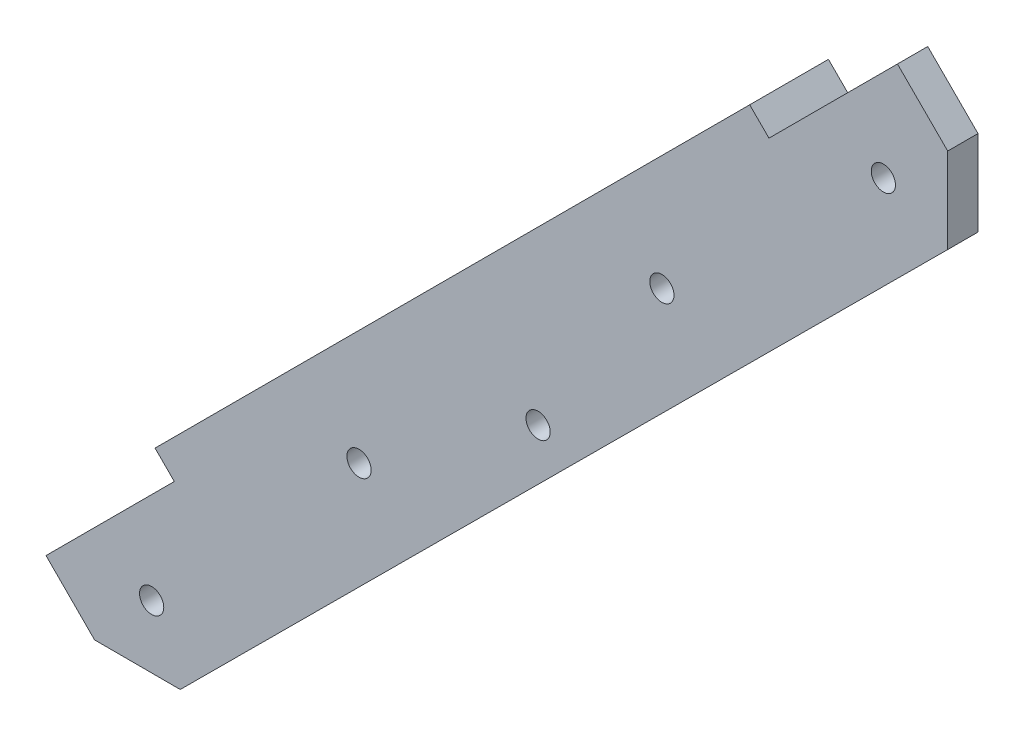
ISO-10303-21;
HEADER;
FILE_DESCRIPTION(('STEP AP214'),'2;1');
FILE_NAME('part.step','',(''),(''),'','','');
FILE_SCHEMA(('AUTOMOTIVE_DESIGN { 1 0 10303 214 1 1 1 1 }'));
ENDSEC;
DATA;
#1=APPLICATION_CONTEXT('core data for automotive mechanical design processes');
#2=APPLICATION_PROTOCOL_DEFINITION('international standard','automotive_design',2000,#1);
#3=PRODUCT_CONTEXT('',#1,'mechanical');
#4=PRODUCT('Part','Part','',(#3));
#5=PRODUCT_RELATED_PRODUCT_CATEGORY('part','',(#4));
#6=PRODUCT_DEFINITION_FORMATION('','',#4);
#7=PRODUCT_DEFINITION_CONTEXT('part definition',#1,'design');
#8=PRODUCT_DEFINITION('design','',#6,#7);
#9=PRODUCT_DEFINITION_SHAPE('','',#8);
#10=(LENGTH_UNIT() NAMED_UNIT(*) SI_UNIT(.MILLI.,.METRE.));
#11=(NAMED_UNIT(*) PLANE_ANGLE_UNIT() SI_UNIT($,.RADIAN.));
#12=(NAMED_UNIT(*) SI_UNIT($,.STERADIAN.) SOLID_ANGLE_UNIT());
#13=UNCERTAINTY_MEASURE_WITH_UNIT(LENGTH_MEASURE(1.E-05),#10,'distance_accuracy_value','');
#14=(GEOMETRIC_REPRESENTATION_CONTEXT(3) GLOBAL_UNCERTAINTY_ASSIGNED_CONTEXT((#13)) GLOBAL_UNIT_ASSIGNED_CONTEXT((#10,
#11,#12)) REPRESENTATION_CONTEXT('',''));
#15=CARTESIAN_POINT('',(0.,0.,0.));
#16=DIRECTION('',(0.,0.,1.));
#17=DIRECTION('',(1.,0.,0.));
#18=AXIS2_PLACEMENT_3D('',#15,#16,#17);
#19=CARTESIAN_POINT('',(111.999999999999,110.,-8.00100000000389));
#20=DIRECTION('',(0.,0.,1.));
#21=DIRECTION('',(1.,0.,0.));
#22=AXIS2_PLACEMENT_3D('',#19,#20,#21);
#23=CYLINDRICAL_SURFACE('',#22,1.99999999999992);
#24=CARTESIAN_POINT('',(111.999999999999,110.,5.));
#25=DIRECTION('',(0.,0.,1.));
#26=DIRECTION('',(1.,0.,0.));
#27=AXIS2_PLACEMENT_3D('',#24,#25,#26);
#28=CIRCLE('',#27,1.99999999999992);
#29=CARTESIAN_POINT('',(113.999999999999,110.,5.));
#30=VERTEX_POINT('',#29);
#31=EDGE_CURVE('E224',#30,#30,#28,.T.);
#32=ORIENTED_EDGE('',*,*,#31,.T.);
#33=EDGE_LOOP('',(#32));
#34=FACE_BOUND('',#33,.T.);
#35=CARTESIAN_POINT('',(111.999999999999,110.,-5.00000000000385));
#36=DIRECTION('',(0.,0.,-1.));
#37=DIRECTION('',(0.,1.,0.));
#38=AXIS2_PLACEMENT_3D('',#35,#36,#37);
#39=CIRCLE('',#38,1.99999999999992);
#40=CARTESIAN_POINT('',(111.999999999999,112.,-5.00000000000385));
#41=VERTEX_POINT('',#40);
#42=EDGE_CURVE('E227',#41,#41,#39,.F.);
#43=ORIENTED_EDGE('',*,*,#42,.F.);
#44=EDGE_LOOP('',(#43));
#45=FACE_BOUND('',#44,.T.);
#46=ADVANCED_FACE('F39',(#34,#45),#23,.F.);
#47=CARTESIAN_POINT('',(61.9999999999991,60.0000000000004,-8.00100000000389));
#48=DIRECTION('',(0.,0.,1.));
#49=DIRECTION('',(1.,0.,0.));
#50=AXIS2_PLACEMENT_3D('',#47,#48,#49);
#51=CYLINDRICAL_SURFACE('',#50,1.99999999999989);
#52=CARTESIAN_POINT('',(61.9999999999991,60.0000000000004,5.));
#53=DIRECTION('',(0.,0.,1.));
#54=DIRECTION('',(1.,0.,0.));
#55=AXIS2_PLACEMENT_3D('',#52,#53,#54);
#56=CIRCLE('',#55,1.99999999999989);
#57=CARTESIAN_POINT('',(63.999999999999,60.0000000000004,5.));
#58=VERTEX_POINT('',#57);
#59=EDGE_CURVE('E220',#58,#58,#56,.T.);
#60=ORIENTED_EDGE('',*,*,#59,.T.);
#61=EDGE_LOOP('',(#60));
#62=FACE_BOUND('',#61,.T.);
#63=CARTESIAN_POINT('',(61.9999999999991,60.0000000000004,-5.00000000000388));
#64=DIRECTION('',(0.,0.,-1.));
#65=DIRECTION('',(0.,1.,0.));
#66=AXIS2_PLACEMENT_3D('',#63,#64,#65);
#67=CIRCLE('',#66,1.99999999999989);
#68=CARTESIAN_POINT('',(61.9999999999991,62.0000000000003,-5.00000000000388));
#69=VERTEX_POINT('',#68);
#70=EDGE_CURVE('E211',#69,#69,#67,.F.);
#71=ORIENTED_EDGE('',*,*,#70,.F.);
#72=EDGE_LOOP('',(#71));
#73=FACE_BOUND('',#72,.T.);
#74=ADVANCED_FACE('F380',(#62,#73),#51,.F.);
#75=CARTESIAN_POINT('',(0.,0.,0.));
#76=DIRECTION('',(0.,0.,-1.));
#77=DIRECTION('',(-1.,0.,0.));
#78=AXIS2_PLACEMENT_3D('',#75,#76,#77);
#79=PLANE('',#78);
#80=DIRECTION('',(0.708378811392067,0.705832458569852,0.));
#81=VECTOR('',#80,1.);
#82=CARTESIAN_POINT('',(144.999999999996,125.000009715621,0.));
#83=LINE('',#82,#81);
#84=CARTESIAN_POINT('',(32.4788703815637,12.8833508286033,0.));
#85=VERTEX_POINT('',#84);
#86=CARTESIAN_POINT('',(46.6133955019609,26.9670676987364,0.));
#87=VERTEX_POINT('',#86);
#88=EDGE_CURVE('E285',#85,#87,#83,.T.);
#89=ORIENTED_EDGE('',*,*,#88,.F.);
#90=DIRECTION('',(0.999998379020512,-0.0018005433478821,0.));
#91=VECTOR('',#90,1.);
#92=CARTESIAN_POINT('',(0.023302289110957,12.9417885805603,0.));
#93=LINE('',#92,#91);
#94=CARTESIAN_POINT('',(18.3367576819445,12.9088143568254,0.));
#95=VERTEX_POINT('',#94);
#96=EDGE_CURVE('E63',#85,#95,#93,.F.);
#97=ORIENTED_EDGE('',*,*,#96,.T.);
#98=DIRECTION('',(0.705832458569853,-0.708378811392066,0.));
#99=VECTOR('',#98,1.);
#100=CARTESIAN_POINT('',(25.3950822676431,5.82502624290472,0.));
#101=LINE('',#100,#99);
#102=CARTESIAN_POINT('',(10.3192285063964,20.9552674757194,0.));
#103=VERTEX_POINT('',#102);
#104=EDGE_CURVE('E269',#103,#95,#101,.T.);
#105=ORIENTED_EDGE('',*,*,#104,.F.);
#106=DIRECTION('',(-0.707106781186551,-0.707106781186544,0.));
#107=VECTOR('',#106,1.);
#108=CARTESIAN_POINT('',(31.5052038200413,42.1412427893641,0.));
#109=LINE('',#108,#107);
#110=CARTESIAN_POINT('',(31.4994745169042,42.1355134862271,0.));
#111=VERTEX_POINT('',#110);
#112=EDGE_CURVE('E295',#111,#103,#109,.T.);
#113=ORIENTED_EDGE('',*,*,#112,.F.);
#114=DIRECTION('',(-0.705832458569853,0.708378811392066,0.));
#115=VECTOR('',#114,1.);
#116=CARTESIAN_POINT('',(28.3232233047018,45.3232233047036,0.));
#117=LINE('',#116,#115);
#118=EDGE_CURVE('E244',#87,#111,#117,.T.);
#119=ORIENTED_EDGE('',*,*,#118,.F.);
#120=EDGE_LOOP('',(#89,#97,#105,#113,#119));
#121=FACE_BOUND('',#120,.T.);
#122=CARTESIAN_POINT('',(27.7621167157391,23.2569128956978,0.));
#123=DIRECTION('',(0.,0.,-1.));
#124=DIRECTION('',(-1.,0.,0.));
#125=AXIS2_PLACEMENT_3D('',#122,#123,#124);
#126=CIRCLE('',#125,2.);
#127=CARTESIAN_POINT('',(25.7621167157391,23.2569128956978,0.));
#128=VERTEX_POINT('',#127);
#129=EDGE_CURVE('E316',#128,#128,#126,.T.);
#130=ORIENTED_EDGE('',*,*,#129,.F.);
#131=EDGE_LOOP('',(#130));
#132=FACE_BOUND('',#131,.T.);
#133=ADVANCED_FACE('F387',(#121,#132),#79,.T.);
#134=CARTESIAN_POINT('',(144.999999999996,125.000009715621,5.));
#135=DIRECTION('',(-0.705832458569852,0.708378811392067,0.));
#136=DIRECTION('',(-0.708378811392067,-0.705832458569852,0.));
#137=AXIS2_PLACEMENT_3D('',#134,#135,#136);
#138=PLANE('',#137);
#139=DIRECTION('',(0.708378811392067,0.705832458569853,0.));
#140=VECTOR('',#139,1.);
#141=CARTESIAN_POINT('',(46.6133955019609,26.9670676987363,-8.00000000000389));
#142=LINE('',#141,#140);
#143=CARTESIAN_POINT('',(46.6133955019609,26.9670676987363,-8.00000000000389));
#144=VERTEX_POINT('',#143);
#145=CARTESIAN_POINT('',(86.0012902722658,66.2133779447775,-8.00000000000387));
#146=VERTEX_POINT('',#145);
#147=EDGE_CURVE('E228',#144,#146,#142,.T.);
#148=ORIENTED_EDGE('',*,*,#147,.T.);
#149=DIRECTION('',(0.,0.,1.));
#150=VECTOR('',#149,1.);
#151=CARTESIAN_POINT('',(86.0012902722658,66.2133779447776,4.99999999999997));
#152=LINE('',#151,#150);
#153=CARTESIAN_POINT('',(86.0012902722658,66.2133779447775,-1.00000000000387));
#154=VERTEX_POINT('',#153);
#155=EDGE_CURVE('E204',#146,#154,#152,.T.);
#156=ORIENTED_EDGE('',*,*,#155,.T.);
#157=DIRECTION('',(-0.708378811392067,-0.705832458569852,0.));
#158=VECTOR('',#157,1.);
#159=CARTESIAN_POINT('',(144.999999999996,125.000009715621,-1.00000000000384));
#160=LINE('',#159,#158);
#161=CARTESIAN_POINT('',(105.612105229692,85.7536994695806,-1.00000000000386));
#162=VERTEX_POINT('',#161);
#163=EDGE_CURVE('E11',#162,#154,#160,.T.);
#164=ORIENTED_EDGE('',*,*,#163,.F.);
#165=DIRECTION('',(0.,0.,-1.));
#166=VECTOR('',#165,1.);
#167=CARTESIAN_POINT('',(105.612105229692,85.7536994695806,4.99999999999998));
#168=LINE('',#167,#166);
#169=CARTESIAN_POINT('',(105.612105229692,85.7536994695806,-8.00000000000386));
#170=VERTEX_POINT('',#169);
#171=EDGE_CURVE('E200',#162,#170,#168,.T.);
#172=ORIENTED_EDGE('',*,*,#171,.T.);
#173=CARTESIAN_POINT('',(144.999999999997,125.000009715622,-8.00000000000384));
#174=VERTEX_POINT('',#173);
#175=EDGE_CURVE('E232',#170,#174,#142,.T.);
#176=ORIENTED_EDGE('',*,*,#175,.T.);
#177=DIRECTION('',(0.,0.,1.));
#178=VECTOR('',#177,1.);
#179=CARTESIAN_POINT('',(144.999999999997,125.000009715622,-172.904201471418));
#180=LINE('',#179,#178);
#181=CARTESIAN_POINT('',(144.999999999997,125.000009715622,0.));
#182=VERTEX_POINT('',#181);
#183=EDGE_CURVE('E253',#174,#182,#180,.T.);
#184=ORIENTED_EDGE('',*,*,#183,.T.);
#185=CARTESIAN_POINT('',(159.167576227838,139.116658887018,0.));
#186=VERTEX_POINT('',#185);
#187=EDGE_CURVE('E288',#182,#186,#83,.T.);
#188=ORIENTED_EDGE('',*,*,#187,.T.);
#189=DIRECTION('',(0.,0.,1.));
#190=VECTOR('',#189,1.);
#191=CARTESIAN_POINT('',(159.167576227838,139.116658887018,5.));
#192=LINE('',#191,#190);
#193=CARTESIAN_POINT('',(159.167576227837,139.116658887018,5.));
#194=VERTEX_POINT('',#193);
#195=EDGE_CURVE('E326',#186,#194,#192,.T.);
#196=ORIENTED_EDGE('',*,*,#195,.T.);
#197=DIRECTION('',(0.708378811392066,0.705832458569853,0.));
#198=VECTOR('',#197,1.);
#199=CARTESIAN_POINT('',(46.6464466094051,27.0000000000003,5.));
#200=LINE('',#199,#198);
#201=CARTESIAN_POINT('',(32.4788703815637,12.8833508286032,5.));
#202=VERTEX_POINT('',#201);
#203=EDGE_CURVE('E265',#202,#194,#200,.T.);
#204=ORIENTED_EDGE('',*,*,#203,.F.);
#205=DIRECTION('',(0.,0.,-1.));
#206=VECTOR('',#205,1.);
#207=CARTESIAN_POINT('',(32.4788703815637,12.8833508286033,5.));
#208=LINE('',#207,#206);
#209=EDGE_CURVE('E323',#202,#85,#208,.T.);
#210=ORIENTED_EDGE('',*,*,#209,.T.);
#211=ORIENTED_EDGE('',*,*,#88,.T.);
#212=DIRECTION('',(0.,0.,1.));
#213=VECTOR('',#212,1.);
#214=CARTESIAN_POINT('',(46.6133955019609,26.9670676987363,-172.904201471418));
#215=LINE('',#214,#213);
#216=EDGE_CURVE('E250',#144,#87,#215,.T.);
#217=ORIENTED_EDGE('',*,*,#216,.F.);
#218=EDGE_LOOP('',(#148,#156,#164,#172,#176,#184,#188,#196,#204,#210,#211,#217));
#219=FACE_BOUND('',#218,.T.);
#220=ADVANCED_FACE('F344',(#219),#138,.F.);
#221=CARTESIAN_POINT('',(166.251364341758,146.174983472716,5.));
#222=DIRECTION('',(-0.707106781186548,-0.707106781186547,0.));
#223=DIRECTION('',(0.707106781186547,-0.707106781186548,0.));
#224=AXIS2_PLACEMENT_3D('',#221,#222,#223);
#225=PLANE('',#224);
#226=DIRECTION('',(-0.707106781186547,0.707106781186548,0.));
#227=VECTOR('',#226,1.);
#228=CARTESIAN_POINT('',(166.251364341758,146.174983472716,5.));
#229=LINE('',#228,#227);
#230=CARTESIAN_POINT('',(159.192993990203,153.233353824272,5.));
#231=VERTEX_POINT('',#230);
#232=CARTESIAN_POINT('',(150.895154422576,161.531193391899,5.));
#233=VERTEX_POINT('',#232);
#234=EDGE_CURVE('E268',#231,#233,#229,.T.);
#235=ORIENTED_EDGE('',*,*,#234,.F.);
#236=DIRECTION('',(0.,0.,-1.));
#237=VECTOR('',#236,1.);
#238=CARTESIAN_POINT('',(159.192993990203,153.233353824272,5.));
#239=LINE('',#238,#237);
#240=CARTESIAN_POINT('',(159.192993990203,153.233353824272,0.));
#241=VERTEX_POINT('',#240);
#242=EDGE_CURVE('E242',#231,#241,#239,.T.);
#243=ORIENTED_EDGE('',*,*,#242,.T.);
#244=DIRECTION('',(-0.707106781186547,0.707106781186548,0.));
#245=VECTOR('',#244,1.);
#246=CARTESIAN_POINT('',(166.251364341758,146.174983472716,0.));
#247=LINE('',#246,#245);
#248=CARTESIAN_POINT('',(150.895154422576,161.531193391899,0.));
#249=VERTEX_POINT('',#248);
#250=EDGE_CURVE('E287',#241,#249,#247,.T.);
#251=ORIENTED_EDGE('',*,*,#250,.T.);
#252=DIRECTION('',(0.,0.,-1.));
#253=VECTOR('',#252,1.);
#254=CARTESIAN_POINT('',(150.895154422576,161.531193391899,5.));
#255=LINE('',#254,#253);
#256=EDGE_CURVE('E243',#233,#249,#255,.T.);
#257=ORIENTED_EDGE('',*,*,#256,.F.);
#258=EDGE_LOOP('',(#235,#243,#251,#257));
#259=FACE_BOUND('',#258,.T.);
#260=ADVANCED_FACE('F437',(#259),#225,.F.);
#261=CARTESIAN_POINT('',(150.895154422576,161.531193391899,5.));
#262=DIRECTION('',(0.7071067811865,-0.707106781186595,0.));
#263=DIRECTION('',(0.707106781186595,0.7071067811865,0.));
#264=AXIS2_PLACEMENT_3D('',#261,#262,#263);
#265=PLANE('',#264);
#266=DIRECTION('',(-0.707106781186595,-0.7071067811865,0.));
#267=VECTOR('',#266,1.);
#268=CARTESIAN_POINT('',(150.895154422576,161.531193391899,0.));
#269=LINE('',#268,#267);
#270=CARTESIAN_POINT('',(129.681985373146,140.318024342472,0.));
#271=VERTEX_POINT('',#270);
#272=EDGE_CURVE('E290',#249,#271,#269,.T.);
#273=ORIENTED_EDGE('',*,*,#272,.T.);
#274=DIRECTION('',(0.,0.,-1.));
#275=VECTOR('',#274,1.);
#276=CARTESIAN_POINT('',(129.681985373146,140.318024342472,5.));
#277=LINE('',#276,#275);
#278=CARTESIAN_POINT('',(129.681985373146,140.318024342472,5.));
#279=VERTEX_POINT('',#278);
#280=EDGE_CURVE('E309',#279,#271,#277,.T.);
#281=ORIENTED_EDGE('',*,*,#280,.F.);
#282=DIRECTION('',(-0.707106781186595,-0.7071067811865,0.));
#283=VECTOR('',#282,1.);
#284=CARTESIAN_POINT('',(150.895154422576,161.531193391899,5.));
#285=LINE('',#284,#283);
#286=EDGE_CURVE('E271',#233,#279,#285,.T.);
#287=ORIENTED_EDGE('',*,*,#286,.F.);
#288=ORIENTED_EDGE('',*,*,#256,.T.);
#289=EDGE_LOOP('',(#273,#281,#287,#288));
#290=FACE_BOUND('',#289,.T.);
#291=ADVANCED_FACE('F434',(#290),#265,.F.);
#292=CARTESIAN_POINT('',(129.681985373146,140.318024342472,5.));
#293=DIRECTION('',(-0.707106781186588,-0.707106781186507,0.));
#294=DIRECTION('',(0.707106781186507,-0.707106781186588,0.));
#295=AXIS2_PLACEMENT_3D('',#292,#293,#294);
#296=PLANE('',#295);
#297=ORIENTED_EDGE('',*,*,#280,.T.);
#298=DIRECTION('',(0.707106781186548,-0.707106781186547,0.));
#299=VECTOR('',#298,1.);
#300=CARTESIAN_POINT('',(144.999999999997,125.000009715622,0.));
#301=LINE('',#300,#299);
#302=EDGE_CURVE('E239',#271,#182,#301,.T.);
#303=ORIENTED_EDGE('',*,*,#302,.T.);
#304=ORIENTED_EDGE('',*,*,#183,.F.);
#305=DIRECTION('',(-0.707106781186548,0.707106781186547,0.));
#306=VECTOR('',#305,1.);
#307=CARTESIAN_POINT('',(144.999999999997,125.000009715622,-8.00000000000384));
#308=LINE('',#307,#306);
#309=CARTESIAN_POINT('',(126.500004857807,143.500004857812,-8.00000000000384));
#310=VERTEX_POINT('',#309);
#311=EDGE_CURVE('E231',#174,#310,#308,.T.);
#312=ORIENTED_EDGE('',*,*,#311,.T.);
#313=DIRECTION('',(0.,0.,-1.));
#314=VECTOR('',#313,1.);
#315=CARTESIAN_POINT('',(126.500004857807,143.500004857812,5.));
#316=LINE('',#315,#314);
#317=CARTESIAN_POINT('',(126.500004857807,143.500004857812,5.));
#318=VERTEX_POINT('',#317);
#319=EDGE_CURVE('E307',#318,#310,#316,.T.);
#320=ORIENTED_EDGE('',*,*,#319,.F.);
#321=DIRECTION('',(-0.707106781186507,0.707106781186588,0.));
#322=VECTOR('',#321,1.);
#323=CARTESIAN_POINT('',(129.681985373146,140.318024342472,5.));
#324=LINE('',#323,#322);
#325=EDGE_CURVE('E273',#279,#318,#324,.T.);
#326=ORIENTED_EDGE('',*,*,#325,.F.);
#327=EDGE_LOOP('',(#297,#303,#304,#312,#320,#326));
#328=FACE_BOUND('',#327,.T.);
#329=ADVANCED_FACE('F360',(#328),#296,.F.);
#330=CARTESIAN_POINT('',(126.500004857807,143.500004857812,5.));
#331=DIRECTION('',(0.707106781186559,-0.707106781186536,0.));
#332=DIRECTION('',(0.707106781186536,0.707106781186559,0.));
#333=AXIS2_PLACEMENT_3D('',#330,#331,#332);
#334=PLANE('',#333);
#335=ORIENTED_EDGE('',*,*,#319,.T.);
#336=DIRECTION('',(-0.707106781186536,-0.707106781186559,0.));
#337=VECTOR('',#336,1.);
#338=CARTESIAN_POINT('',(126.500004857807,143.500004857812,-8.00000000000384));
#339=LINE('',#338,#337);
#340=CARTESIAN_POINT('',(28.3232233047018,45.3232233047036,-8.00000000000389));
#341=VERTEX_POINT('',#340);
#342=EDGE_CURVE('E235',#310,#341,#339,.T.);
#343=ORIENTED_EDGE('',*,*,#342,.T.);
#344=DIRECTION('',(0.,0.,1.));
#345=VECTOR('',#344,1.);
#346=CARTESIAN_POINT('',(28.3232233047018,45.3232233047036,-172.904201471418));
#347=LINE('',#346,#345);
#348=CARTESIAN_POINT('',(28.3232233047018,45.3232233047036,0.));
#349=VERTEX_POINT('',#348);
#350=EDGE_CURVE('E247',#341,#349,#347,.T.);
#351=ORIENTED_EDGE('',*,*,#350,.T.);
#352=DIRECTION('',(0.,0.,-1.));
#353=VECTOR('',#352,1.);
#354=CARTESIAN_POINT('',(28.3232233047018,45.3232233047036,5.));
#355=LINE('',#354,#353);
#356=CARTESIAN_POINT('',(28.3232233047018,45.3232233047036,5.));
#357=VERTEX_POINT('',#356);
#358=EDGE_CURVE('E305',#357,#349,#355,.T.);
#359=ORIENTED_EDGE('',*,*,#358,.F.);
#360=DIRECTION('',(-0.707106781186536,-0.707106781186559,0.));
#361=VECTOR('',#360,1.);
#362=CARTESIAN_POINT('',(126.500004857807,143.500004857812,5.));
#363=LINE('',#362,#361);
#364=EDGE_CURVE('E275',#318,#357,#363,.T.);
#365=ORIENTED_EDGE('',*,*,#364,.F.);
#366=EDGE_LOOP('',(#335,#343,#351,#359,#365));
#367=FACE_BOUND('',#366,.T.);
#368=ADVANCED_FACE('F354',(#367),#334,.F.);
#369=CARTESIAN_POINT('',(28.3232233047018,45.3232233047036,5.));
#370=DIRECTION('',(0.707106781186548,0.707106781186547,0.));
#371=DIRECTION('',(-0.707106781186547,0.707106781186548,0.));
#372=AXIS2_PLACEMENT_3D('',#369,#370,#371);
#373=PLANE('',#372);
#374=DIRECTION('',(0.707106781186547,-0.707106781186548,0.));
#375=VECTOR('',#374,1.);
#376=CARTESIAN_POINT('',(28.3232233047018,45.3232233047036,0.));
#377=LINE('',#376,#375);
#378=CARTESIAN_POINT('',(31.5052038200413,42.1412427893641,0.));
#379=VERTEX_POINT('',#378);
#380=EDGE_CURVE('E293',#349,#379,#377,.T.);
#381=ORIENTED_EDGE('',*,*,#380,.T.);
#382=DIRECTION('',(0.,0.,-1.));
#383=VECTOR('',#382,1.);
#384=CARTESIAN_POINT('',(31.5052038200413,42.1412427893641,5.));
#385=LINE('',#384,#383);
#386=CARTESIAN_POINT('',(31.5052038200413,42.1412427893641,5.));
#387=VERTEX_POINT('',#386);
#388=EDGE_CURVE('E302',#387,#379,#385,.T.);
#389=ORIENTED_EDGE('',*,*,#388,.F.);
#390=DIRECTION('',(0.707106781186547,-0.707106781186548,0.));
#391=VECTOR('',#390,1.);
#392=CARTESIAN_POINT('',(28.3232233047018,45.3232233047036,5.));
#393=LINE('',#392,#391);
#394=EDGE_CURVE('E277',#357,#387,#393,.T.);
#395=ORIENTED_EDGE('',*,*,#394,.F.);
#396=ORIENTED_EDGE('',*,*,#358,.T.);
#397=EDGE_LOOP('',(#381,#389,#395,#396));
#398=FACE_BOUND('',#397,.T.);
#399=ADVANCED_FACE('F425',(#398),#373,.F.);
#400=CARTESIAN_POINT('',(31.5052038200413,42.1412427893641,5.));
#401=DIRECTION('',(0.707106781186544,-0.707106781186551,0.));
#402=DIRECTION('',(0.707106781186551,0.707106781186544,0.));
#403=AXIS2_PLACEMENT_3D('',#400,#401,#402);
#404=PLANE('',#403);
#405=EDGE_CURVE('E296',#379,#111,#109,.T.);
#406=ORIENTED_EDGE('',*,*,#405,.T.);
#407=ORIENTED_EDGE('',*,*,#112,.T.);
#408=DIRECTION('',(0.,0.,-1.));
#409=VECTOR('',#408,1.);
#410=CARTESIAN_POINT('',(10.3192285063964,20.9552674757194,5.));
#411=LINE('',#410,#409);
#412=CARTESIAN_POINT('',(10.3192285063964,20.9552674757194,5.));
#413=VERTEX_POINT('',#412);
#414=EDGE_CURVE('E284',#413,#103,#411,.T.);
#415=ORIENTED_EDGE('',*,*,#414,.F.);
#416=DIRECTION('',(-0.707106781186551,-0.707106781186544,0.));
#417=VECTOR('',#416,1.);
#418=CARTESIAN_POINT('',(31.5052038200413,42.1412427893641,5.));
#419=LINE('',#418,#417);
#420=EDGE_CURVE('E279',#387,#413,#419,.T.);
#421=ORIENTED_EDGE('',*,*,#420,.F.);
#422=ORIENTED_EDGE('',*,*,#388,.T.);
#423=EDGE_LOOP('',(#406,#407,#415,#421,#422));
#424=FACE_BOUND('',#423,.T.);
#425=ADVANCED_FACE('F421',(#424),#404,.F.);
#426=CARTESIAN_POINT('',(25.3950822676431,5.82502624290472,5.));
#427=DIRECTION('',(0.708378811392066,0.705832458569853,0.));
#428=DIRECTION('',(-0.705832458569853,0.708378811392066,0.));
#429=AXIS2_PLACEMENT_3D('',#426,#427,#428);
#430=PLANE('',#429);
#431=ORIENTED_EDGE('',*,*,#104,.T.);
#432=DIRECTION('',(0.,0.,1.));
#433=VECTOR('',#432,1.);
#434=CARTESIAN_POINT('',(18.3367576819445,12.9088143568254,5.));
#435=LINE('',#434,#433);
#436=CARTESIAN_POINT('',(18.3367576819445,12.9088143568254,5.));
#437=VERTEX_POINT('',#436);
#438=EDGE_CURVE('E333',#95,#437,#435,.T.);
#439=ORIENTED_EDGE('',*,*,#438,.T.);
#440=DIRECTION('',(0.705832458569853,-0.708378811392066,0.));
#441=VECTOR('',#440,1.);
#442=CARTESIAN_POINT('',(25.3950822676431,5.82502624290472,5.));
#443=LINE('',#442,#441);
#444=EDGE_CURVE('E281',#413,#437,#443,.T.);
#445=ORIENTED_EDGE('',*,*,#444,.F.);
#446=ORIENTED_EDGE('',*,*,#414,.T.);
#447=EDGE_LOOP('',(#431,#439,#445,#446));
#448=FACE_BOUND('',#447,.T.);
#449=ADVANCED_FACE('F414',(#448),#430,.F.);
#450=CARTESIAN_POINT('',(0.,0.,5.));
#451=DIRECTION('',(0.,0.,-1.));
#452=DIRECTION('',(-1.,0.,0.));
#453=AXIS2_PLACEMENT_3D('',#450,#451,#452);
#454=PLANE('',#453);
#455=CARTESIAN_POINT('',(91.5640570638597,80.2261793942983,5.));
#456=DIRECTION('',(0.,0.,-1.));
#457=DIRECTION('',(-1.,0.,0.));
#458=AXIS2_PLACEMENT_3D('',#455,#456,#457);
#459=CIRCLE('',#458,2.00000000000003);
#460=CARTESIAN_POINT('',(89.5640570638597,80.2261793942983,5.));
#461=VERTEX_POINT('',#460);
#462=EDGE_CURVE('E191',#461,#461,#459,.T.);
#463=ORIENTED_EDGE('',*,*,#462,.T.);
#464=EDGE_LOOP('',(#463));
#465=FACE_BOUND('',#464,.T.);
#466=ORIENTED_EDGE('',*,*,#59,.F.);
#467=EDGE_LOOP('',(#466));
#468=FACE_BOUND('',#467,.T.);
#469=ORIENTED_EDGE('',*,*,#31,.F.);
#470=EDGE_LOOP('',(#469));
#471=FACE_BOUND('',#470,.T.);
#472=CARTESIAN_POINT('',(27.7621167157391,23.2569128956978,5.));
#473=DIRECTION('',(0.,0.,1.));
#474=DIRECTION('',(1.,0.,0.));
#475=AXIS2_PLACEMENT_3D('',#472,#473,#474);
#476=CIRCLE('',#475,2.);
#477=CARTESIAN_POINT('',(29.7621167157391,23.2569128956978,5.));
#478=VERTEX_POINT('',#477);
#479=EDGE_CURVE('E259',#478,#478,#476,.T.);
#480=ORIENTED_EDGE('',*,*,#479,.F.);
#481=EDGE_LOOP('',(#480));
#482=FACE_BOUND('',#481,.T.);
#483=CARTESIAN_POINT('',(148.566315266813,144.061111446774,5.));
#484=DIRECTION('',(0.,0.,1.));
#485=DIRECTION('',(1.,0.,0.));
#486=AXIS2_PLACEMENT_3D('',#483,#484,#485);
#487=CIRCLE('',#486,2.);
#488=CARTESIAN_POINT('',(150.566315266813,144.061111446774,5.));
#489=VERTEX_POINT('',#488);
#490=EDGE_CURVE('E238',#489,#489,#487,.T.);
#491=ORIENTED_EDGE('',*,*,#490,.F.);
#492=EDGE_LOOP('',(#491));
#493=FACE_BOUND('',#492,.T.);
#494=ORIENTED_EDGE('',*,*,#203,.T.);
#495=DIRECTION('',(-0.00180054334788453,-0.999998379020513,0.));
#496=VECTOR('',#495,1.);
#497=CARTESIAN_POINT('',(159.192993990203,153.233353824272,5.));
#498=LINE('',#497,#496);
#499=EDGE_CURVE('E330',#194,#231,#498,.F.);
#500=ORIENTED_EDGE('',*,*,#499,.T.);
#501=ORIENTED_EDGE('',*,*,#234,.T.);
#502=ORIENTED_EDGE('',*,*,#286,.T.);
#503=ORIENTED_EDGE('',*,*,#325,.T.);
#504=ORIENTED_EDGE('',*,*,#364,.T.);
#505=ORIENTED_EDGE('',*,*,#394,.T.);
#506=ORIENTED_EDGE('',*,*,#420,.T.);
#507=ORIENTED_EDGE('',*,*,#444,.T.);
#508=DIRECTION('',(-0.999998379020512,0.0018005433478821,0.));
#509=VECTOR('',#508,1.);
#510=CARTESIAN_POINT('',(32.4788703815637,12.8833508286033,5.));
#511=LINE('',#510,#509);
#512=EDGE_CURVE('E328',#437,#202,#511,.F.);
#513=ORIENTED_EDGE('',*,*,#512,.T.);
#514=EDGE_LOOP('',(#494,#500,#501,#502,#503,#504,#505,#506,#507,#513));
#515=FACE_BOUND('',#514,.T.);
#516=ADVANCED_FACE('F411',(#465,#468,#471,#482,#493,#515),#454,.F.);
#517=ORIENTED_EDGE('',*,*,#250,.F.);
#518=DIRECTION('',(0.00180054334788453,0.999998379020513,0.));
#519=VECTOR('',#518,1.);
#520=CARTESIAN_POINT('',(158.916575044796,-0.286136645887134,0.));
#521=LINE('',#520,#519);
#522=EDGE_CURVE('E321',#241,#186,#521,.F.);
#523=ORIENTED_EDGE('',*,*,#522,.T.);
#524=ORIENTED_EDGE('',*,*,#187,.F.);
#525=ORIENTED_EDGE('',*,*,#302,.F.);
#526=ORIENTED_EDGE('',*,*,#272,.F.);
#527=EDGE_LOOP('',(#517,#523,#524,#525,#526));
#528=FACE_BOUND('',#527,.T.);
#529=CARTESIAN_POINT('',(148.566315266813,144.061111446774,0.));
#530=DIRECTION('',(0.,0.,-1.));
#531=DIRECTION('',(-1.,0.,0.));
#532=AXIS2_PLACEMENT_3D('',#529,#530,#531);
#533=CIRCLE('',#532,2.);
#534=CARTESIAN_POINT('',(146.566315266813,144.061111446774,0.));
#535=VERTEX_POINT('',#534);
#536=EDGE_CURVE('E262',#535,#535,#533,.T.);
#537=ORIENTED_EDGE('',*,*,#536,.F.);
#538=EDGE_LOOP('',(#537));
#539=FACE_BOUND('',#538,.T.);
#540=ADVANCED_FACE('F409',(#528,#539),#79,.T.);
#541=CARTESIAN_POINT('',(148.566315266813,144.061111446774,-10.));
#542=DIRECTION('',(0.,0.,1.));
#543=DIRECTION('',(1.,0.,0.));
#544=AXIS2_PLACEMENT_3D('',#541,#542,#543);
#545=CYLINDRICAL_SURFACE('',#544,2.);
#546=ORIENTED_EDGE('',*,*,#536,.T.);
#547=EDGE_LOOP('',(#546));
#548=FACE_BOUND('',#547,.T.);
#549=ORIENTED_EDGE('',*,*,#490,.T.);
#550=EDGE_LOOP('',(#549));
#551=FACE_BOUND('',#550,.T.);
#552=ADVANCED_FACE('F405',(#548,#551),#545,.F.);
#553=CARTESIAN_POINT('',(27.7621167157391,23.2569128956978,-10.));
#554=DIRECTION('',(0.,0.,1.));
#555=DIRECTION('',(1.,0.,0.));
#556=AXIS2_PLACEMENT_3D('',#553,#554,#555);
#557=CYLINDRICAL_SURFACE('',#556,2.);
#558=ORIENTED_EDGE('',*,*,#129,.T.);
#559=EDGE_LOOP('',(#558));
#560=FACE_BOUND('',#559,.T.);
#561=ORIENTED_EDGE('',*,*,#479,.T.);
#562=EDGE_LOOP('',(#561));
#563=FACE_BOUND('',#562,.T.);
#564=ADVANCED_FACE('F399',(#560,#563),#557,.F.);
#565=CARTESIAN_POINT('',(0.,0.,0.));
#566=DIRECTION('',(0.,0.,-1.));
#567=DIRECTION('',(-1.,0.,0.));
#568=AXIS2_PLACEMENT_3D('',#565,#566,#567);
#569=PLANE('',#568);
#570=ORIENTED_EDGE('',*,*,#405,.F.);
#571=ORIENTED_EDGE('',*,*,#380,.F.);
#572=EDGE_CURVE('E223',#111,#349,#117,.T.);
#573=ORIENTED_EDGE('',*,*,#572,.F.);
#574=EDGE_LOOP('',(#570,#571,#573));
#575=FACE_BOUND('',#574,.T.);
#576=ADVANCED_FACE('F396',(#575),#569,.F.);
#577=CARTESIAN_POINT('',(28.3232233047018,45.3232233047036,-172.904201471418));
#578=DIRECTION('',(0.708378811392067,0.705832458569853,0.));
#579=DIRECTION('',(-0.705832458569853,0.708378811392067,0.));
#580=AXIS2_PLACEMENT_3D('',#577,#578,#579);
#581=PLANE('',#580);
#582=ORIENTED_EDGE('',*,*,#350,.F.);
#583=DIRECTION('',(0.705832458569853,-0.708378811392067,0.));
#584=VECTOR('',#583,1.);
#585=CARTESIAN_POINT('',(28.3232233047018,45.3232233047036,-8.00000000000389));
#586=LINE('',#585,#584);
#587=EDGE_CURVE('E256',#341,#144,#586,.T.);
#588=ORIENTED_EDGE('',*,*,#587,.T.);
#589=ORIENTED_EDGE('',*,*,#216,.T.);
#590=ORIENTED_EDGE('',*,*,#118,.T.);
#591=ORIENTED_EDGE('',*,*,#572,.T.);
#592=EDGE_LOOP('',(#582,#588,#589,#590,#591));
#593=FACE_BOUND('',#592,.T.);
#594=ADVANCED_FACE('F349',(#593),#581,.F.);
#595=CARTESIAN_POINT('',(171.999999999999,2.68739913555306,-8.00000000000387));
#596=DIRECTION('',(0.,0.,1.));
#597=DIRECTION('',(0.,1.,0.));
#598=AXIS2_PLACEMENT_3D('',#595,#596,#597);
#599=PLANE('',#598);
#600=CARTESIAN_POINT('',(61.9999999999991,60.0000000000004,-8.00000000000388));
#601=DIRECTION('',(0.,0.,-1.));
#602=DIRECTION('',(0.,1.,0.));
#603=AXIS2_PLACEMENT_3D('',#600,#601,#602);
#604=CIRCLE('',#603,4.00000000000013);
#605=CARTESIAN_POINT('',(61.9999999999991,64.0000000000005,-8.00000000000388));
#606=VERTEX_POINT('',#605);
#607=EDGE_CURVE('E212',#606,#606,#604,.T.);
#608=ORIENTED_EDGE('',*,*,#607,.F.);
#609=EDGE_LOOP('',(#608));
#610=FACE_BOUND('',#609,.T.);
#611=CARTESIAN_POINT('',(111.999999999999,110.,-8.00000000000385));
#612=DIRECTION('',(0.,0.,-1.));
#613=DIRECTION('',(0.,1.,0.));
#614=AXIS2_PLACEMENT_3D('',#611,#612,#613);
#615=CIRCLE('',#614,4.00000000000013);
#616=CARTESIAN_POINT('',(111.999999999999,114.,-8.00000000000385));
#617=VERTEX_POINT('',#616);
#618=EDGE_CURVE('E207',#617,#617,#615,.T.);
#619=ORIENTED_EDGE('',*,*,#618,.F.);
#620=EDGE_LOOP('',(#619));
#621=FACE_BOUND('',#620,.T.);
#622=DIRECTION('',(0.707106781186547,0.707106781186547,0.));
#623=VECTOR('',#622,1.);
#624=CARTESIAN_POINT('',(82.4224368911741,79.5698405958513,-8.00000000000387));
#625=LINE('',#624,#623);
#626=CARTESIAN_POINT('',(82.4224368911741,79.5698405958513,-8.00000000000387));
#627=VERTEX_POINT('',#626);
#628=CARTESIAN_POINT('',(92.2203958623068,89.367799566984,-8.00000000000386));
#629=VERTEX_POINT('',#628);
#630=EDGE_CURVE('E55',#627,#629,#625,.T.);
#631=ORIENTED_EDGE('',*,*,#630,.F.);
#632=DIRECTION('',(0.25881904510252,-0.965925826289068,0.));
#633=VECTOR('',#632,1.);
#634=CARTESIAN_POINT('',(107.643606179988,-14.5568446162981,-8.00000000000388));
#635=LINE('',#634,#633);
#636=EDGE_CURVE('E48',#627,#146,#635,.T.);
#637=ORIENTED_EDGE('',*,*,#636,.T.);
#638=ORIENTED_EDGE('',*,*,#147,.F.);
#639=ORIENTED_EDGE('',*,*,#587,.F.);
#640=ORIENTED_EDGE('',*,*,#342,.F.);
#641=ORIENTED_EDGE('',*,*,#311,.F.);
#642=ORIENTED_EDGE('',*,*,#175,.F.);
#643=DIRECTION('',(0.258819045102521,-0.965925826289068,0.));
#644=VECTOR('',#643,1.);
#645=CARTESIAN_POINT('',(105.604656722112,85.7814976783118,-8.00000000000386));
#646=LINE('',#645,#644);
#647=CARTESIAN_POINT('',(105.604656722112,85.7814976783118,-8.00000000000386));
#648=VERTEX_POINT('',#647);
#649=EDGE_CURVE('E186',#648,#170,#646,.T.);
#650=ORIENTED_EDGE('',*,*,#649,.F.);
#651=DIRECTION('',(0.965925826289068,-0.258819045102521,0.));
#652=VECTOR('',#651,1.);
#653=CARTESIAN_POINT('',(92.2203958623068,89.367799566984,-8.00000000000386));
#654=LINE('',#653,#652);
#655=EDGE_CURVE('E188',#629,#648,#654,.T.);
#656=ORIENTED_EDGE('',*,*,#655,.F.);
#657=EDGE_LOOP('',(#631,#637,#638,#639,#640,#641,#642,#650,#656));
#658=FACE_BOUND('',#657,.T.);
#659=ADVANCED_FACE('F340',(#610,#621,#658),#599,.F.);
#660=CARTESIAN_POINT('',(159.192993990203,153.233353824272,5.));
#661=DIRECTION('',(-0.999998379020512,0.00180054334788453,0.));
#662=DIRECTION('',(0.,0.,-1.));
#663=AXIS2_PLACEMENT_3D('',#660,#661,#662);
#664=PLANE('',#663);
#665=ORIENTED_EDGE('',*,*,#499,.F.);
#666=ORIENTED_EDGE('',*,*,#195,.F.);
#667=ORIENTED_EDGE('',*,*,#522,.F.);
#668=ORIENTED_EDGE('',*,*,#242,.F.);
#669=EDGE_LOOP('',(#665,#666,#667,#668));
#670=FACE_BOUND('',#669,.T.);
#671=ADVANCED_FACE('F394',(#670),#664,.F.);
#672=CARTESIAN_POINT('',(32.4788703815637,12.8833508286033,5.));
#673=DIRECTION('',(0.0018005433478821,0.999998379020512,0.));
#674=DIRECTION('',(0.,0.,-1.));
#675=AXIS2_PLACEMENT_3D('',#672,#673,#674);
#676=PLANE('',#675);
#677=ORIENTED_EDGE('',*,*,#512,.F.);
#678=ORIENTED_EDGE('',*,*,#438,.F.);
#679=ORIENTED_EDGE('',*,*,#96,.F.);
#680=ORIENTED_EDGE('',*,*,#209,.F.);
#681=EDGE_LOOP('',(#677,#678,#679,#680));
#682=FACE_BOUND('',#681,.T.);
#683=ADVANCED_FACE('F42',(#682),#676,.F.);
#684=CARTESIAN_POINT('',(61.9999999999991,60.0000000000004,-5.00000000000388));
#685=DIRECTION('',(0.,0.,-1.));
#686=DIRECTION('',(0.,1.,0.));
#687=AXIS2_PLACEMENT_3D('',#684,#685,#686);
#688=PLANE('',#687);
#689=CARTESIAN_POINT('',(61.9999999999991,60.0000000000004,-5.00000000000388));
#690=DIRECTION('',(0.,0.,-1.));
#691=DIRECTION('',(0.,1.,0.));
#692=AXIS2_PLACEMENT_3D('',#689,#690,#691);
#693=CIRCLE('',#692,4.00000000000013);
#694=CARTESIAN_POINT('',(61.9999999999991,64.0000000000005,-5.00000000000388));
#695=VERTEX_POINT('',#694);
#696=EDGE_CURVE('E208',#695,#695,#693,.T.);
#697=ORIENTED_EDGE('',*,*,#696,.T.);
#698=EDGE_LOOP('',(#697));
#699=FACE_BOUND('',#698,.T.);
#700=ORIENTED_EDGE('',*,*,#70,.T.);
#701=EDGE_LOOP('',(#700));
#702=FACE_BOUND('',#701,.T.);
#703=ADVANCED_FACE('F450',(#699,#702),#688,.T.);
#704=CARTESIAN_POINT('',(61.9999999999991,60.0000000000004,-5.00000000000388));
#705=DIRECTION('',(0.,0.,-1.));
#706=DIRECTION('',(0.,1.,0.));
#707=AXIS2_PLACEMENT_3D('',#704,#705,#706);
#708=CYLINDRICAL_SURFACE('',#707,4.00000000000013);
#709=ORIENTED_EDGE('',*,*,#696,.F.);
#710=EDGE_LOOP('',(#709));
#711=FACE_BOUND('',#710,.T.);
#712=ORIENTED_EDGE('',*,*,#607,.T.);
#713=EDGE_LOOP('',(#712));
#714=FACE_BOUND('',#713,.T.);
#715=ADVANCED_FACE('F563',(#711,#714),#708,.F.);
#716=CARTESIAN_POINT('',(111.999999999999,110.,-5.00000000000385));
#717=DIRECTION('',(0.,0.,-1.));
#718=DIRECTION('',(0.,1.,0.));
#719=AXIS2_PLACEMENT_3D('',#716,#717,#718);
#720=PLANE('',#719);
#721=CARTESIAN_POINT('',(111.999999999999,110.,-5.00000000000385));
#722=DIRECTION('',(0.,0.,-1.));
#723=DIRECTION('',(0.,1.,0.));
#724=AXIS2_PLACEMENT_3D('',#721,#722,#723);
#725=CIRCLE('',#724,4.00000000000013);
#726=CARTESIAN_POINT('',(111.999999999999,114.,-5.00000000000385));
#727=VERTEX_POINT('',#726);
#728=EDGE_CURVE('E215',#727,#727,#725,.T.);
#729=ORIENTED_EDGE('',*,*,#728,.T.);
#730=EDGE_LOOP('',(#729));
#731=FACE_BOUND('',#730,.T.);
#732=ORIENTED_EDGE('',*,*,#42,.T.);
#733=EDGE_LOOP('',(#732));
#734=FACE_BOUND('',#733,.T.);
#735=ADVANCED_FACE('F571',(#731,#734),#720,.T.);
#736=CARTESIAN_POINT('',(111.999999999999,110.,-5.00000000000385));
#737=DIRECTION('',(0.,0.,-1.));
#738=DIRECTION('',(0.,1.,0.));
#739=AXIS2_PLACEMENT_3D('',#736,#737,#738);
#740=CYLINDRICAL_SURFACE('',#739,4.00000000000013);
#741=ORIENTED_EDGE('',*,*,#728,.F.);
#742=EDGE_LOOP('',(#741));
#743=FACE_BOUND('',#742,.T.);
#744=ORIENTED_EDGE('',*,*,#618,.T.);
#745=EDGE_LOOP('',(#744));
#746=FACE_BOUND('',#745,.T.);
#747=ADVANCED_FACE('F376',(#743,#746),#740,.F.);
#748=CARTESIAN_POINT('',(0.,0.,-1.00000000000391));
#749=DIRECTION('',(0.,0.,-1.));
#750=DIRECTION('',(0.,1.,0.));
#751=AXIS2_PLACEMENT_3D('',#748,#749,#750);
#752=PLANE('',#751);
#753=CARTESIAN_POINT('',(91.5640570638597,80.2261793942983,-1.00000000000386));
#754=DIRECTION('',(0.,0.,-1.));
#755=DIRECTION('',(0.,1.,0.));
#756=AXIS2_PLACEMENT_3D('',#753,#754,#755);
#757=CIRCLE('',#756,2.00000000000003);
#758=CARTESIAN_POINT('',(91.5640570638597,82.2261793942984,-1.00000000000386));
#759=VERTEX_POINT('',#758);
#760=EDGE_CURVE('E620',#759,#759,#757,.T.);
#761=ORIENTED_EDGE('',*,*,#760,.F.);
#762=EDGE_LOOP('',(#761));
#763=FACE_BOUND('',#762,.T.);
#764=ORIENTED_EDGE('',*,*,#163,.T.);
#765=DIRECTION('',(-0.258819045102521,0.965925826289068,0.));
#766=VECTOR('',#765,1.);
#767=CARTESIAN_POINT('',(86.0087387798463,66.1855797360463,-1.00000000000387));
#768=LINE('',#767,#766);
#769=CARTESIAN_POINT('',(82.4224368911741,79.5698405958513,-1.00000000000387));
#770=VERTEX_POINT('',#769);
#771=EDGE_CURVE('E173',#154,#770,#768,.T.);
#772=ORIENTED_EDGE('',*,*,#771,.T.);
#773=DIRECTION('',(0.707106781186547,0.707106781186547,0.));
#774=VECTOR('',#773,1.);
#775=CARTESIAN_POINT('',(82.4224368911741,79.5698405958513,-1.00000000000387));
#776=LINE('',#775,#774);
#777=CARTESIAN_POINT('',(92.2203958623068,89.367799566984,-1.00000000000386));
#778=VERTEX_POINT('',#777);
#779=EDGE_CURVE('E168',#770,#778,#776,.T.);
#780=ORIENTED_EDGE('',*,*,#779,.T.);
#781=DIRECTION('',(0.965925826289068,-0.258819045102521,0.));
#782=VECTOR('',#781,1.);
#783=CARTESIAN_POINT('',(92.2203958623068,89.367799566984,-1.00000000000386));
#784=LINE('',#783,#782);
#785=CARTESIAN_POINT('',(105.604656722112,85.7814976783118,-1.00000000000386));
#786=VERTEX_POINT('',#785);
#787=EDGE_CURVE('E176',#778,#786,#784,.T.);
#788=ORIENTED_EDGE('',*,*,#787,.T.);
#789=DIRECTION('',(0.258819045102521,-0.965925826289068,0.));
#790=VECTOR('',#789,1.);
#791=CARTESIAN_POINT('',(105.604656722112,85.7814976783118,-1.00000000000386));
#792=LINE('',#791,#790);
#793=EDGE_CURVE('E181',#786,#162,#792,.T.);
#794=ORIENTED_EDGE('',*,*,#793,.T.);
#795=EDGE_LOOP('',(#764,#772,#780,#788,#794));
#796=FACE_BOUND('',#795,.T.);
#797=ADVANCED_FACE('F183',(#763,#796),#752,.T.);
#798=CARTESIAN_POINT('',(86.0087387798463,66.1855797360463,-1.00000000000387));
#799=DIRECTION('',(-0.965925826289069,-0.258819045102521,0.));
#800=DIRECTION('',(0.25881904510252,-0.965925826289068,0.));
#801=AXIS2_PLACEMENT_3D('',#798,#799,#800);
#802=PLANE('',#801);
#803=ORIENTED_EDGE('',*,*,#636,.F.);
#804=DIRECTION('',(0.,0.,-1.));
#805=VECTOR('',#804,1.);
#806=CARTESIAN_POINT('',(82.4224368911741,79.5698405958513,-1.00000000000387));
#807=LINE('',#806,#805);
#808=EDGE_CURVE('E198',#770,#627,#807,.T.);
#809=ORIENTED_EDGE('',*,*,#808,.F.);
#810=ORIENTED_EDGE('',*,*,#771,.F.);
#811=ORIENTED_EDGE('',*,*,#155,.F.);
#812=EDGE_LOOP('',(#803,#809,#810,#811));
#813=FACE_BOUND('',#812,.T.);
#814=ADVANCED_FACE('F367',(#813),#802,.F.);
#815=CARTESIAN_POINT('',(105.604656722112,85.7814976783118,-1.00000000000386));
#816=DIRECTION('',(0.965925826289068,0.258819045102521,0.));
#817=DIRECTION('',(-0.258819045102521,0.965925826289068,0.));
#818=AXIS2_PLACEMENT_3D('',#815,#816,#817);
#819=PLANE('',#818);
#820=ORIENTED_EDGE('',*,*,#793,.F.);
#821=DIRECTION('',(0.,0.,-1.));
#822=VECTOR('',#821,1.);
#823=CARTESIAN_POINT('',(105.604656722112,85.7814976783118,-1.00000000000386));
#824=LINE('',#823,#822);
#825=EDGE_CURVE('E172',#786,#648,#824,.T.);
#826=ORIENTED_EDGE('',*,*,#825,.T.);
#827=ORIENTED_EDGE('',*,*,#649,.T.);
#828=ORIENTED_EDGE('',*,*,#171,.F.);
#829=EDGE_LOOP('',(#820,#826,#827,#828));
#830=FACE_BOUND('',#829,.T.);
#831=ADVANCED_FACE('F366',(#830),#819,.F.);
#832=CARTESIAN_POINT('',(82.4224368911741,79.5698405958513,-1.00000000000387));
#833=DIRECTION('',(-0.707106781186548,0.707106781186548,0.));
#834=DIRECTION('',(-0.707106781186548,-0.707106781186548,0.));
#835=AXIS2_PLACEMENT_3D('',#832,#833,#834);
#836=PLANE('',#835);
#837=ORIENTED_EDGE('',*,*,#630,.T.);
#838=DIRECTION('',(0.,0.,-1.));
#839=VECTOR('',#838,1.);
#840=CARTESIAN_POINT('',(92.2203958623068,89.367799566984,-1.00000000000386));
#841=LINE('',#840,#839);
#842=EDGE_CURVE('E164',#778,#629,#841,.T.);
#843=ORIENTED_EDGE('',*,*,#842,.F.);
#844=ORIENTED_EDGE('',*,*,#779,.F.);
#845=ORIENTED_EDGE('',*,*,#808,.T.);
#846=EDGE_LOOP('',(#837,#843,#844,#845));
#847=FACE_BOUND('',#846,.T.);
#848=ADVANCED_FACE('F166',(#847),#836,.F.);
#849=CARTESIAN_POINT('',(92.2203958623068,89.367799566984,-1.00000000000386));
#850=DIRECTION('',(0.258819045102521,0.965925826289069,0.));
#851=DIRECTION('',(-0.965925826289068,0.25881904510252,0.));
#852=AXIS2_PLACEMENT_3D('',#849,#850,#851);
#853=PLANE('',#852);
#854=ORIENTED_EDGE('',*,*,#655,.T.);
#855=ORIENTED_EDGE('',*,*,#825,.F.);
#856=ORIENTED_EDGE('',*,*,#787,.F.);
#857=ORIENTED_EDGE('',*,*,#842,.T.);
#858=EDGE_LOOP('',(#854,#855,#856,#857));
#859=FACE_BOUND('',#858,.T.);
#860=ADVANCED_FACE('F177',(#859),#853,.F.);
#861=CARTESIAN_POINT('',(91.5640570638597,80.2261793942983,15.9999999999961));
#862=DIRECTION('',(0.,0.,-1.));
#863=DIRECTION('',(0.,1.,0.));
#864=AXIS2_PLACEMENT_3D('',#861,#862,#863);
#865=CYLINDRICAL_SURFACE('',#864,2.00000000000003);
#866=ORIENTED_EDGE('',*,*,#760,.T.);
#867=EDGE_LOOP('',(#866));
#868=FACE_BOUND('',#867,.T.);
#869=ORIENTED_EDGE('',*,*,#462,.F.);
#870=EDGE_LOOP('',(#869));
#871=FACE_BOUND('',#870,.T.);
#872=ADVANCED_FACE('F609',(#868,#871),#865,.F.);
#873=CLOSED_SHELL('',(#46,#74,#133,#220,#260,#291,#329,#368,#399,#425,#449,#516,#540,#552,#564,
#576,#594,#659,#671,#683,#703,#715,#735,#747,#797,#814,#831,#848,#860,#872));
#874=MANIFOLD_SOLID_BREP('B2',#873);
#875=ADVANCED_BREP_SHAPE_REPRESENTATION('',(#18,#874),#14);
#876=SHAPE_DEFINITION_REPRESENTATION(#9,#875);
ENDSEC;
END-ISO-10303-21;
